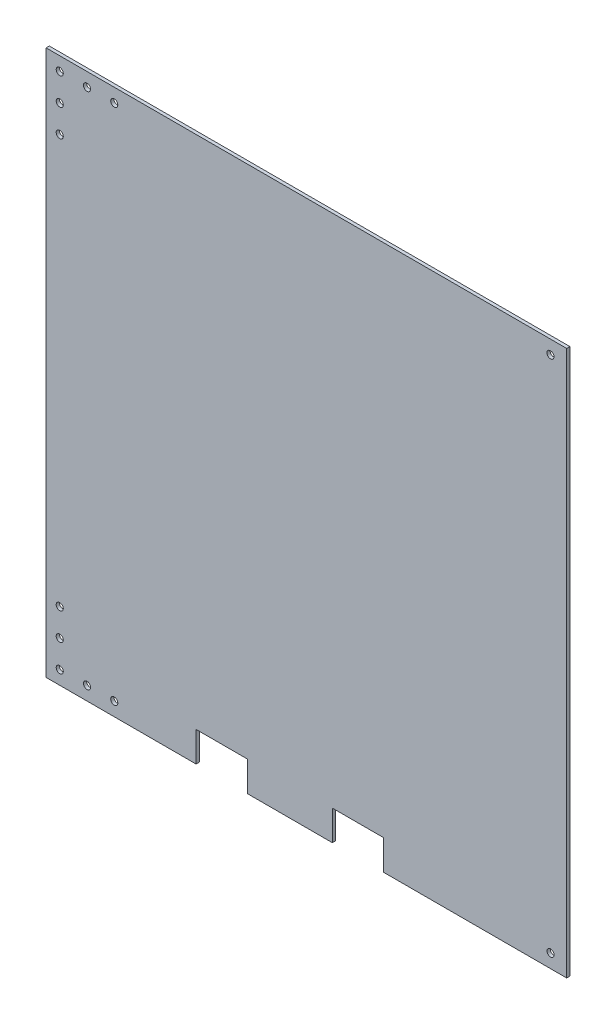
ISO-10303-21;
HEADER;
FILE_DESCRIPTION(('STEP AP214'),'2;1');
FILE_NAME('part.step','',(''),(''),'','','');
FILE_SCHEMA(('AUTOMOTIVE_DESIGN { 1 0 10303 214 1 1 1 1 }'));
ENDSEC;
DATA;
#1=APPLICATION_CONTEXT('core data for automotive mechanical design processes');
#2=APPLICATION_PROTOCOL_DEFINITION('international standard','automotive_design',2000,#1);
#3=PRODUCT_CONTEXT('',#1,'mechanical');
#4=PRODUCT('Part','Part','',(#3));
#5=PRODUCT_RELATED_PRODUCT_CATEGORY('part','',(#4));
#6=PRODUCT_DEFINITION_FORMATION('','',#4);
#7=PRODUCT_DEFINITION_CONTEXT('part definition',#1,'design');
#8=PRODUCT_DEFINITION('design','',#6,#7);
#9=PRODUCT_DEFINITION_SHAPE('','',#8);
#10=(LENGTH_UNIT() NAMED_UNIT(*) SI_UNIT(.MILLI.,.METRE.));
#11=(NAMED_UNIT(*) PLANE_ANGLE_UNIT() SI_UNIT($,.RADIAN.));
#12=(NAMED_UNIT(*) SI_UNIT($,.STERADIAN.) SOLID_ANGLE_UNIT());
#13=UNCERTAINTY_MEASURE_WITH_UNIT(LENGTH_MEASURE(1.E-05),#10,'distance_accuracy_value','');
#14=(GEOMETRIC_REPRESENTATION_CONTEXT(3) GLOBAL_UNCERTAINTY_ASSIGNED_CONTEXT((#13)) GLOBAL_UNIT_ASSIGNED_CONTEXT((#10,
#11,#12)) REPRESENTATION_CONTEXT('',''));
#15=CARTESIAN_POINT('',(0.,0.,0.));
#16=DIRECTION('',(0.,0.,1.));
#17=DIRECTION('',(1.,0.,0.));
#18=AXIS2_PLACEMENT_3D('',#15,#16,#17);
#19=CARTESIAN_POINT('',(1073.9531966176,-544.101289470653,3.));
#20=DIRECTION('',(0.,1.,0.));
#21=DIRECTION('',(0.,0.,1.));
#22=AXIS2_PLACEMENT_3D('',#19,#20,#21);
#23=PLANE('',#22);
#24=DIRECTION('',(1.,0.,0.));
#25=VECTOR('',#24,1.);
#26=CARTESIAN_POINT('',(1073.9531966176,-544.101289470653,0.));
#27=LINE('',#26,#25);
#28=CARTESIAN_POINT('',(1073.9531966176,-544.101289470653,0.));
#29=VERTEX_POINT('',#28);
#30=CARTESIAN_POINT('',(1213.6531966176,-544.101289470653,0.));
#31=VERTEX_POINT('',#30);
#32=EDGE_CURVE('E139',#29,#31,#27,.T.);
#33=ORIENTED_EDGE('',*,*,#32,.T.);
#34=DIRECTION('',(0.,0.,1.));
#35=VECTOR('',#34,1.);
#36=CARTESIAN_POINT('',(1213.6531966176,-544.101289470653,0.));
#37=LINE('',#36,#35);
#38=CARTESIAN_POINT('',(1213.6531966176,-544.101289470653,3.));
#39=VERTEX_POINT('',#38);
#40=EDGE_CURVE('E125',#31,#39,#37,.T.);
#41=ORIENTED_EDGE('',*,*,#40,.T.);
#42=DIRECTION('',(1.,0.,0.));
#43=VECTOR('',#42,1.);
#44=CARTESIAN_POINT('',(1073.9531966176,-544.101289470653,3.));
#45=LINE('',#44,#43);
#46=CARTESIAN_POINT('',(1073.9531966176,-544.101289470653,3.));
#47=VERTEX_POINT('',#46);
#48=EDGE_CURVE('E172',#47,#39,#45,.T.);
#49=ORIENTED_EDGE('',*,*,#48,.F.);
#50=DIRECTION('',(0.,0.,-1.));
#51=VECTOR('',#50,1.);
#52=CARTESIAN_POINT('',(1073.9531966176,-544.101289470653,3.));
#53=LINE('',#52,#51);
#54=EDGE_CURVE('E11',#47,#29,#53,.T.);
#55=ORIENTED_EDGE('',*,*,#54,.T.);
#56=EDGE_LOOP('',(#33,#41,#49,#55));
#57=FACE_BOUND('',#56,.T.);
#58=ADVANCED_FACE('F36',(#57),#23,.F.);
#59=CARTESIAN_POINT('',(1261.4051966176,-544.101289470653,3.));
#60=VERTEX_POINT('',#59);
#61=CARTESIAN_POINT('',(1340.6531966176,-544.101289470653,3.));
#62=VERTEX_POINT('',#61);
#63=EDGE_CURVE('E174',#60,#62,#45,.T.);
#64=ORIENTED_EDGE('',*,*,#63,.F.);
#65=DIRECTION('',(0.,0.,1.));
#66=VECTOR('',#65,1.);
#67=CARTESIAN_POINT('',(1261.4051966176,-544.101289470653,0.));
#68=LINE('',#67,#66);
#69=CARTESIAN_POINT('',(1261.4051966176,-544.101289470653,0.));
#70=VERTEX_POINT('',#69);
#71=EDGE_CURVE('E134',#70,#60,#68,.T.);
#72=ORIENTED_EDGE('',*,*,#71,.F.);
#73=CARTESIAN_POINT('',(1340.6531966176,-544.101289470653,0.));
#74=VERTEX_POINT('',#73);
#75=EDGE_CURVE('E147',#70,#74,#27,.T.);
#76=ORIENTED_EDGE('',*,*,#75,.T.);
#77=DIRECTION('',(0.,0.,1.));
#78=VECTOR('',#77,1.);
#79=CARTESIAN_POINT('',(1340.6531966176,-544.101289470653,0.));
#80=LINE('',#79,#78);
#81=EDGE_CURVE('E200',#74,#62,#80,.T.);
#82=ORIENTED_EDGE('',*,*,#81,.T.);
#83=EDGE_LOOP('',(#64,#72,#76,#82));
#84=FACE_BOUND('',#83,.T.);
#85=ADVANCED_FACE('F330',(#84),#23,.F.);
#86=CARTESIAN_POINT('',(1073.9531966176,-36.101289470653,3.));
#87=DIRECTION('',(1.,0.,0.));
#88=DIRECTION('',(0.,0.,-1.));
#89=AXIS2_PLACEMENT_3D('',#86,#87,#88);
#90=PLANE('',#89);
#91=DIRECTION('',(0.,-1.,0.));
#92=VECTOR('',#91,1.);
#93=CARTESIAN_POINT('',(1073.9531966176,-36.101289470653,0.));
#94=LINE('',#93,#92);
#95=CARTESIAN_POINT('',(1073.9531966176,-36.101289470653,0.));
#96=VERTEX_POINT('',#95);
#97=EDGE_CURVE('E154',#96,#29,#94,.T.);
#98=ORIENTED_EDGE('',*,*,#97,.T.);
#99=ORIENTED_EDGE('',*,*,#54,.F.);
#100=DIRECTION('',(0.,-1.,0.));
#101=VECTOR('',#100,1.);
#102=CARTESIAN_POINT('',(1073.9531966176,-36.101289470653,3.));
#103=LINE('',#102,#101);
#104=CARTESIAN_POINT('',(1073.9531966176,-36.101289470653,3.));
#105=VERTEX_POINT('',#104);
#106=EDGE_CURVE('E176',#105,#47,#103,.T.);
#107=ORIENTED_EDGE('',*,*,#106,.F.);
#108=DIRECTION('',(0.,0.,-1.));
#109=VECTOR('',#108,1.);
#110=CARTESIAN_POINT('',(1073.9531966176,-36.101289470653,3.));
#111=LINE('',#110,#109);
#112=EDGE_CURVE('E169',#105,#96,#111,.T.);
#113=ORIENTED_EDGE('',*,*,#112,.T.);
#114=EDGE_LOOP('',(#98,#99,#107,#113));
#115=FACE_BOUND('',#114,.T.);
#116=ADVANCED_FACE('F38',(#115),#90,.F.);
#117=CARTESIAN_POINT('',(1388.4051966176,-544.101289470653,3.));
#118=VERTEX_POINT('',#117);
#119=CARTESIAN_POINT('',(1558.9531966176,-544.101289470653,3.));
#120=VERTEX_POINT('',#119);
#121=EDGE_CURVE('E175',#118,#120,#45,.T.);
#122=ORIENTED_EDGE('',*,*,#121,.F.);
#123=DIRECTION('',(0.,0.,1.));
#124=VECTOR('',#123,1.);
#125=CARTESIAN_POINT('',(1388.4051966176,-544.101289470653,0.));
#126=LINE('',#125,#124);
#127=CARTESIAN_POINT('',(1388.4051966176,-544.101289470653,0.));
#128=VERTEX_POINT('',#127);
#129=EDGE_CURVE('E203',#128,#118,#126,.T.);
#130=ORIENTED_EDGE('',*,*,#129,.F.);
#131=CARTESIAN_POINT('',(1558.9531966176,-544.101289470653,0.));
#132=VERTEX_POINT('',#131);
#133=EDGE_CURVE('E149',#128,#132,#27,.T.);
#134=ORIENTED_EDGE('',*,*,#133,.T.);
#135=DIRECTION('',(0.,0.,-1.));
#136=VECTOR('',#135,1.);
#137=CARTESIAN_POINT('',(1558.9531966176,-544.101289470653,3.));
#138=LINE('',#137,#136);
#139=EDGE_CURVE('E44',#120,#132,#138,.T.);
#140=ORIENTED_EDGE('',*,*,#139,.F.);
#141=EDGE_LOOP('',(#122,#130,#134,#140));
#142=FACE_BOUND('',#141,.T.);
#143=ADVANCED_FACE('F331',(#142),#23,.F.);
#144=CARTESIAN_POINT('',(1558.9531966176,-36.101289470653,3.));
#145=DIRECTION('',(-1.,0.,0.));
#146=DIRECTION('',(0.,0.,1.));
#147=AXIS2_PLACEMENT_3D('',#144,#145,#146);
#148=PLANE('',#147);
#149=DIRECTION('',(0.,1.,0.));
#150=VECTOR('',#149,1.);
#151=CARTESIAN_POINT('',(1558.9531966176,-36.101289470653,0.));
#152=LINE('',#151,#150);
#153=CARTESIAN_POINT('',(1558.9531966176,-36.101289470653,0.));
#154=VERTEX_POINT('',#153);
#155=EDGE_CURVE('E146',#132,#154,#152,.T.);
#156=ORIENTED_EDGE('',*,*,#155,.T.);
#157=DIRECTION('',(0.,0.,-1.));
#158=VECTOR('',#157,1.);
#159=CARTESIAN_POINT('',(1558.9531966176,-36.101289470653,3.));
#160=LINE('',#159,#158);
#161=CARTESIAN_POINT('',(1558.9531966176,-36.101289470653,3.));
#162=VERTEX_POINT('',#161);
#163=EDGE_CURVE('E604',#162,#154,#160,.T.);
#164=ORIENTED_EDGE('',*,*,#163,.F.);
#165=DIRECTION('',(0.,1.,0.));
#166=VECTOR('',#165,1.);
#167=CARTESIAN_POINT('',(1558.9531966176,-36.101289470653,3.));
#168=LINE('',#167,#166);
#169=EDGE_CURVE('E170',#120,#162,#168,.T.);
#170=ORIENTED_EDGE('',*,*,#169,.F.);
#171=ORIENTED_EDGE('',*,*,#139,.T.);
#172=EDGE_LOOP('',(#156,#164,#170,#171));
#173=FACE_BOUND('',#172,.T.);
#174=ADVANCED_FACE('F338',(#173),#148,.F.);
#175=CARTESIAN_POINT('',(1073.9531966176,-36.101289470653,3.));
#176=DIRECTION('',(0.,-1.,0.));
#177=DIRECTION('',(0.,0.,-1.));
#178=AXIS2_PLACEMENT_3D('',#175,#176,#177);
#179=PLANE('',#178);
#180=DIRECTION('',(-1.,0.,0.));
#181=VECTOR('',#180,1.);
#182=CARTESIAN_POINT('',(1073.9531966176,-36.101289470653,0.));
#183=LINE('',#182,#181);
#184=EDGE_CURVE('E150',#154,#96,#183,.T.);
#185=ORIENTED_EDGE('',*,*,#184,.T.);
#186=ORIENTED_EDGE('',*,*,#112,.F.);
#187=DIRECTION('',(-1.,0.,0.));
#188=VECTOR('',#187,1.);
#189=CARTESIAN_POINT('',(1073.9531966176,-36.101289470653,3.));
#190=LINE('',#189,#188);
#191=EDGE_CURVE('E167',#162,#105,#190,.T.);
#192=ORIENTED_EDGE('',*,*,#191,.F.);
#193=ORIENTED_EDGE('',*,*,#163,.T.);
#194=EDGE_LOOP('',(#185,#186,#192,#193));
#195=FACE_BOUND('',#194,.T.);
#196=ADVANCED_FACE('F298',(#195),#179,.F.);
#197=CARTESIAN_POINT('',(0.,0.,3.));
#198=DIRECTION('',(0.,0.,1.));
#199=DIRECTION('',(1.,0.,0.));
#200=AXIS2_PLACEMENT_3D('',#197,#198,#199);
#201=PLANE('',#200);
#202=CARTESIAN_POINT('',(1137.4531966176,-531.401289470653,3.));
#203=DIRECTION('',(0.,0.,1.));
#204=DIRECTION('',(1.,0.,0.));
#205=AXIS2_PLACEMENT_3D('',#202,#203,#204);
#206=CIRCLE('',#205,3.30199999999981);
#207=CARTESIAN_POINT('',(1140.7551966176,-531.401289470653,3.));
#208=VERTEX_POINT('',#207);
#209=EDGE_CURVE('E243',#208,#208,#206,.T.);
#210=ORIENTED_EDGE('',*,*,#209,.F.);
#211=EDGE_LOOP('',(#210));
#212=FACE_BOUND('',#211,.T.);
#213=CARTESIAN_POINT('',(1112.0531966176,-531.401289470653,3.));
#214=DIRECTION('',(0.,0.,1.));
#215=DIRECTION('',(1.,0.,0.));
#216=AXIS2_PLACEMENT_3D('',#213,#214,#215);
#217=CIRCLE('',#216,3.30199999999981);
#218=CARTESIAN_POINT('',(1115.3551966176,-531.401289470653,3.));
#219=VERTEX_POINT('',#218);
#220=EDGE_CURVE('E249',#219,#219,#217,.T.);
#221=ORIENTED_EDGE('',*,*,#220,.F.);
#222=EDGE_LOOP('',(#221));
#223=FACE_BOUND('',#222,.T.);
#224=CARTESIAN_POINT('',(1086.6531966176,-506.001289470653,3.));
#225=DIRECTION('',(0.,0.,1.));
#226=DIRECTION('',(1.,0.,0.));
#227=AXIS2_PLACEMENT_3D('',#224,#225,#226);
#228=CIRCLE('',#227,3.30199999999981);
#229=CARTESIAN_POINT('',(1089.9551966176,-506.001289470653,3.));
#230=VERTEX_POINT('',#229);
#231=EDGE_CURVE('E255',#230,#230,#228,.T.);
#232=ORIENTED_EDGE('',*,*,#231,.F.);
#233=EDGE_LOOP('',(#232));
#234=FACE_BOUND('',#233,.T.);
#235=CARTESIAN_POINT('',(1086.6531966176,-480.601289470653,3.));
#236=DIRECTION('',(0.,0.,1.));
#237=DIRECTION('',(1.,0.,0.));
#238=AXIS2_PLACEMENT_3D('',#235,#236,#237);
#239=CIRCLE('',#238,3.30199999999982);
#240=CARTESIAN_POINT('',(1089.9551966176,-480.601289470653,3.));
#241=VERTEX_POINT('',#240);
#242=EDGE_CURVE('E261',#241,#241,#239,.T.);
#243=ORIENTED_EDGE('',*,*,#242,.F.);
#244=EDGE_LOOP('',(#243));
#245=FACE_BOUND('',#244,.T.);
#246=CARTESIAN_POINT('',(1086.6531966176,-99.601289470653,3.));
#247=DIRECTION('',(0.,0.,1.));
#248=DIRECTION('',(1.,0.,0.));
#249=AXIS2_PLACEMENT_3D('',#246,#247,#248);
#250=CIRCLE('',#249,3.30199999999982);
#251=CARTESIAN_POINT('',(1089.9551966176,-99.601289470653,3.));
#252=VERTEX_POINT('',#251);
#253=EDGE_CURVE('E267',#252,#252,#250,.T.);
#254=ORIENTED_EDGE('',*,*,#253,.F.);
#255=EDGE_LOOP('',(#254));
#256=FACE_BOUND('',#255,.T.);
#257=CARTESIAN_POINT('',(1086.6531966176,-74.201289470653,3.));
#258=DIRECTION('',(0.,0.,1.));
#259=DIRECTION('',(1.,0.,0.));
#260=AXIS2_PLACEMENT_3D('',#257,#258,#259);
#261=CIRCLE('',#260,3.30199999999982);
#262=CARTESIAN_POINT('',(1089.9551966176,-74.201289470653,3.));
#263=VERTEX_POINT('',#262);
#264=EDGE_CURVE('E273',#263,#263,#261,.T.);
#265=ORIENTED_EDGE('',*,*,#264,.F.);
#266=EDGE_LOOP('',(#265));
#267=FACE_BOUND('',#266,.T.);
#268=CARTESIAN_POINT('',(1137.4531966176,-48.801289470653,3.));
#269=DIRECTION('',(0.,0.,1.));
#270=DIRECTION('',(1.,0.,0.));
#271=AXIS2_PLACEMENT_3D('',#268,#269,#270);
#272=CIRCLE('',#271,3.30199999999982);
#273=CARTESIAN_POINT('',(1140.7551966176,-48.801289470653,3.));
#274=VERTEX_POINT('',#273);
#275=EDGE_CURVE('E279',#274,#274,#272,.T.);
#276=ORIENTED_EDGE('',*,*,#275,.F.);
#277=EDGE_LOOP('',(#276));
#278=FACE_BOUND('',#277,.T.);
#279=CARTESIAN_POINT('',(1112.0531966176,-48.801289470653,3.));
#280=DIRECTION('',(0.,0.,1.));
#281=DIRECTION('',(1.,0.,0.));
#282=AXIS2_PLACEMENT_3D('',#279,#280,#281);
#283=CIRCLE('',#282,3.30199999999982);
#284=CARTESIAN_POINT('',(1115.3551966176,-48.801289470653,3.));
#285=VERTEX_POINT('',#284);
#286=EDGE_CURVE('E237',#285,#285,#283,.T.);
#287=ORIENTED_EDGE('',*,*,#286,.F.);
#288=EDGE_LOOP('',(#287));
#289=FACE_BOUND('',#288,.T.);
#290=DIRECTION('',(0.,-1.,0.));
#291=VECTOR('',#290,1.);
#292=CARTESIAN_POINT('',(1213.6531966176,-544.101289470653,3.));
#293=LINE('',#292,#291);
#294=CARTESIAN_POINT('',(1213.6531966176,-516.161289470653,3.));
#295=VERTEX_POINT('',#294);
#296=EDGE_CURVE('E130',#295,#39,#293,.T.);
#297=ORIENTED_EDGE('',*,*,#296,.F.);
#298=DIRECTION('',(-1.,0.,0.));
#299=VECTOR('',#298,1.);
#300=CARTESIAN_POINT('',(1213.6531966176,-516.161289470653,3.));
#301=LINE('',#300,#299);
#302=CARTESIAN_POINT('',(1261.4051966176,-516.161289470653,3.));
#303=VERTEX_POINT('',#302);
#304=EDGE_CURVE('E142',#303,#295,#301,.T.);
#305=ORIENTED_EDGE('',*,*,#304,.F.);
#306=DIRECTION('',(0.,1.,0.));
#307=VECTOR('',#306,1.);
#308=CARTESIAN_POINT('',(1261.4051966176,-544.101289470653,3.));
#309=LINE('',#308,#307);
#310=EDGE_CURVE('E231',#60,#303,#309,.T.);
#311=ORIENTED_EDGE('',*,*,#310,.F.);
#312=ORIENTED_EDGE('',*,*,#63,.T.);
#313=DIRECTION('',(0.,-1.,0.));
#314=VECTOR('',#313,1.);
#315=CARTESIAN_POINT('',(1340.6531966176,-544.101289470653,3.));
#316=LINE('',#315,#314);
#317=CARTESIAN_POINT('',(1340.6531966176,-516.161289470653,3.));
#318=VERTEX_POINT('',#317);
#319=EDGE_CURVE('E216',#318,#62,#316,.T.);
#320=ORIENTED_EDGE('',*,*,#319,.F.);
#321=DIRECTION('',(-1.,0.,0.));
#322=VECTOR('',#321,1.);
#323=CARTESIAN_POINT('',(1340.6531966176,-516.161289470653,3.));
#324=LINE('',#323,#322);
#325=CARTESIAN_POINT('',(1388.4051966176,-516.161289470653,3.));
#326=VERTEX_POINT('',#325);
#327=EDGE_CURVE('E209',#326,#318,#324,.T.);
#328=ORIENTED_EDGE('',*,*,#327,.F.);
#329=DIRECTION('',(0.,1.,0.));
#330=VECTOR('',#329,1.);
#331=CARTESIAN_POINT('',(1388.4051966176,-544.101289470653,3.));
#332=LINE('',#331,#330);
#333=EDGE_CURVE('E213',#118,#326,#332,.T.);
#334=ORIENTED_EDGE('',*,*,#333,.F.);
#335=ORIENTED_EDGE('',*,*,#121,.T.);
#336=ORIENTED_EDGE('',*,*,#169,.T.);
#337=ORIENTED_EDGE('',*,*,#191,.T.);
#338=ORIENTED_EDGE('',*,*,#106,.T.);
#339=ORIENTED_EDGE('',*,*,#48,.T.);
#340=EDGE_LOOP('',(#297,#305,#311,#312,#320,#328,#334,#335,#336,#337,#338,#339));
#341=FACE_BOUND('',#340,.T.);
#342=CARTESIAN_POINT('',(1086.6531966176,-531.401289470653,3.));
#343=DIRECTION('',(0.,0.,1.));
#344=DIRECTION('',(1.,0.,0.));
#345=AXIS2_PLACEMENT_3D('',#342,#343,#344);
#346=CIRCLE('',#345,3.29500000000008);
#347=CARTESIAN_POINT('',(1089.9481966176,-531.401289470653,3.));
#348=VERTEX_POINT('',#347);
#349=EDGE_CURVE('E182',#348,#348,#346,.T.);
#350=ORIENTED_EDGE('',*,*,#349,.F.);
#351=EDGE_LOOP('',(#350));
#352=FACE_BOUND('',#351,.T.);
#353=CARTESIAN_POINT('',(1543.9671966176,-531.401289470653,3.));
#354=DIRECTION('',(0.,0.,1.));
#355=DIRECTION('',(1.,0.,0.));
#356=AXIS2_PLACEMENT_3D('',#353,#354,#355);
#357=CIRCLE('',#356,3.29500000000008);
#358=CARTESIAN_POINT('',(1547.2621966176,-531.401289470653,3.));
#359=VERTEX_POINT('',#358);
#360=EDGE_CURVE('E189',#359,#359,#357,.T.);
#361=ORIENTED_EDGE('',*,*,#360,.F.);
#362=EDGE_LOOP('',(#361));
#363=FACE_BOUND('',#362,.T.);
#364=CARTESIAN_POINT('',(1543.8531966176,-48.801289470653,3.));
#365=DIRECTION('',(0.,0.,1.));
#366=DIRECTION('',(1.,0.,0.));
#367=AXIS2_PLACEMENT_3D('',#364,#365,#366);
#368=CIRCLE('',#367,3.2950000000001);
#369=CARTESIAN_POINT('',(1547.1481966176,-48.801289470653,3.));
#370=VERTEX_POINT('',#369);
#371=EDGE_CURVE('E195',#370,#370,#368,.T.);
#372=ORIENTED_EDGE('',*,*,#371,.F.);
#373=EDGE_LOOP('',(#372));
#374=FACE_BOUND('',#373,.T.);
#375=CARTESIAN_POINT('',(1086.6531966176,-48.801289470653,3.));
#376=DIRECTION('',(0.,0.,1.));
#377=DIRECTION('',(1.,0.,0.));
#378=AXIS2_PLACEMENT_3D('',#375,#376,#377);
#379=CIRCLE('',#378,3.2950000000001);
#380=CARTESIAN_POINT('',(1089.9481966176,-48.801289470653,3.));
#381=VERTEX_POINT('',#380);
#382=EDGE_CURVE('E164',#381,#381,#379,.T.);
#383=ORIENTED_EDGE('',*,*,#382,.F.);
#384=EDGE_LOOP('',(#383));
#385=FACE_BOUND('',#384,.T.);
#386=ADVANCED_FACE('F295',(#212,#223,#234,#245,#256,#267,#278,#289,#341,#352,#363,#374,#385),
#201,.T.);
#387=CARTESIAN_POINT('',(0.,0.,0.));
#388=DIRECTION('',(0.,0.,1.));
#389=DIRECTION('',(1.,0.,0.));
#390=AXIS2_PLACEMENT_3D('',#387,#388,#389);
#391=PLANE('',#390);
#392=CARTESIAN_POINT('',(1137.4531966176,-531.401289470653,0.));
#393=DIRECTION('',(0.,0.,1.));
#394=DIRECTION('',(1.,0.,0.));
#395=AXIS2_PLACEMENT_3D('',#392,#393,#394);
#396=CIRCLE('',#395,3.30199999999981);
#397=CARTESIAN_POINT('',(1140.7551966176,-531.401289470653,0.));
#398=VERTEX_POINT('',#397);
#399=EDGE_CURVE('E246',#398,#398,#396,.T.);
#400=ORIENTED_EDGE('',*,*,#399,.T.);
#401=EDGE_LOOP('',(#400));
#402=FACE_BOUND('',#401,.T.);
#403=CARTESIAN_POINT('',(1112.0531966176,-531.401289470653,0.));
#404=DIRECTION('',(0.,0.,1.));
#405=DIRECTION('',(1.,0.,0.));
#406=AXIS2_PLACEMENT_3D('',#403,#404,#405);
#407=CIRCLE('',#406,3.30199999999981);
#408=CARTESIAN_POINT('',(1115.3551966176,-531.401289470653,0.));
#409=VERTEX_POINT('',#408);
#410=EDGE_CURVE('E252',#409,#409,#407,.T.);
#411=ORIENTED_EDGE('',*,*,#410,.T.);
#412=EDGE_LOOP('',(#411));
#413=FACE_BOUND('',#412,.T.);
#414=CARTESIAN_POINT('',(1086.6531966176,-506.001289470653,0.));
#415=DIRECTION('',(0.,0.,1.));
#416=DIRECTION('',(1.,0.,0.));
#417=AXIS2_PLACEMENT_3D('',#414,#415,#416);
#418=CIRCLE('',#417,3.30199999999981);
#419=CARTESIAN_POINT('',(1089.9551966176,-506.001289470653,0.));
#420=VERTEX_POINT('',#419);
#421=EDGE_CURVE('E258',#420,#420,#418,.T.);
#422=ORIENTED_EDGE('',*,*,#421,.T.);
#423=EDGE_LOOP('',(#422));
#424=FACE_BOUND('',#423,.T.);
#425=CARTESIAN_POINT('',(1086.6531966176,-480.601289470653,0.));
#426=DIRECTION('',(0.,0.,1.));
#427=DIRECTION('',(1.,0.,0.));
#428=AXIS2_PLACEMENT_3D('',#425,#426,#427);
#429=CIRCLE('',#428,3.30199999999982);
#430=CARTESIAN_POINT('',(1089.9551966176,-480.601289470653,0.));
#431=VERTEX_POINT('',#430);
#432=EDGE_CURVE('E264',#431,#431,#429,.T.);
#433=ORIENTED_EDGE('',*,*,#432,.T.);
#434=EDGE_LOOP('',(#433));
#435=FACE_BOUND('',#434,.T.);
#436=CARTESIAN_POINT('',(1086.6531966176,-99.601289470653,0.));
#437=DIRECTION('',(0.,0.,1.));
#438=DIRECTION('',(1.,0.,0.));
#439=AXIS2_PLACEMENT_3D('',#436,#437,#438);
#440=CIRCLE('',#439,3.30199999999982);
#441=CARTESIAN_POINT('',(1089.9551966176,-99.601289470653,0.));
#442=VERTEX_POINT('',#441);
#443=EDGE_CURVE('E270',#442,#442,#440,.T.);
#444=ORIENTED_EDGE('',*,*,#443,.T.);
#445=EDGE_LOOP('',(#444));
#446=FACE_BOUND('',#445,.T.);
#447=CARTESIAN_POINT('',(1086.6531966176,-74.201289470653,0.));
#448=DIRECTION('',(0.,0.,1.));
#449=DIRECTION('',(1.,0.,0.));
#450=AXIS2_PLACEMENT_3D('',#447,#448,#449);
#451=CIRCLE('',#450,3.30199999999982);
#452=CARTESIAN_POINT('',(1089.9551966176,-74.201289470653,0.));
#453=VERTEX_POINT('',#452);
#454=EDGE_CURVE('E276',#453,#453,#451,.T.);
#455=ORIENTED_EDGE('',*,*,#454,.T.);
#456=EDGE_LOOP('',(#455));
#457=FACE_BOUND('',#456,.T.);
#458=CARTESIAN_POINT('',(1137.4531966176,-48.801289470653,0.));
#459=DIRECTION('',(0.,0.,1.));
#460=DIRECTION('',(1.,0.,0.));
#461=AXIS2_PLACEMENT_3D('',#458,#459,#460);
#462=CIRCLE('',#461,3.30199999999982);
#463=CARTESIAN_POINT('',(1140.7551966176,-48.801289470653,0.));
#464=VERTEX_POINT('',#463);
#465=EDGE_CURVE('E240',#464,#464,#462,.T.);
#466=ORIENTED_EDGE('',*,*,#465,.T.);
#467=EDGE_LOOP('',(#466));
#468=FACE_BOUND('',#467,.T.);
#469=CARTESIAN_POINT('',(1112.0531966176,-48.801289470653,0.));
#470=DIRECTION('',(0.,0.,1.));
#471=DIRECTION('',(1.,0.,0.));
#472=AXIS2_PLACEMENT_3D('',#469,#470,#471);
#473=CIRCLE('',#472,3.30199999999982);
#474=CARTESIAN_POINT('',(1115.3551966176,-48.801289470653,0.));
#475=VERTEX_POINT('',#474);
#476=EDGE_CURVE('E218',#475,#475,#473,.T.);
#477=ORIENTED_EDGE('',*,*,#476,.T.);
#478=EDGE_LOOP('',(#477));
#479=FACE_BOUND('',#478,.T.);
#480=CARTESIAN_POINT('',(1086.6531966176,-531.401289470653,0.));
#481=DIRECTION('',(0.,0.,1.));
#482=DIRECTION('',(1.,0.,0.));
#483=AXIS2_PLACEMENT_3D('',#480,#481,#482);
#484=CIRCLE('',#483,3.29500000000008);
#485=CARTESIAN_POINT('',(1089.9481966176,-531.401289470653,0.));
#486=VERTEX_POINT('',#485);
#487=EDGE_CURVE('E185',#486,#486,#484,.T.);
#488=ORIENTED_EDGE('',*,*,#487,.T.);
#489=EDGE_LOOP('',(#488));
#490=FACE_BOUND('',#489,.T.);
#491=CARTESIAN_POINT('',(1543.9671966176,-531.401289470653,0.));
#492=DIRECTION('',(0.,0.,1.));
#493=DIRECTION('',(1.,0.,0.));
#494=AXIS2_PLACEMENT_3D('',#491,#492,#493);
#495=CIRCLE('',#494,3.29500000000008);
#496=CARTESIAN_POINT('',(1547.2621966176,-531.401289470653,0.));
#497=VERTEX_POINT('',#496);
#498=EDGE_CURVE('E192',#497,#497,#495,.T.);
#499=ORIENTED_EDGE('',*,*,#498,.T.);
#500=EDGE_LOOP('',(#499));
#501=FACE_BOUND('',#500,.T.);
#502=CARTESIAN_POINT('',(1543.8531966176,-48.801289470653,0.));
#503=DIRECTION('',(0.,0.,1.));
#504=DIRECTION('',(1.,0.,0.));
#505=AXIS2_PLACEMENT_3D('',#502,#503,#504);
#506=CIRCLE('',#505,3.2950000000001);
#507=CARTESIAN_POINT('',(1547.1481966176,-48.801289470653,0.));
#508=VERTEX_POINT('',#507);
#509=EDGE_CURVE('E180',#508,#508,#506,.T.);
#510=ORIENTED_EDGE('',*,*,#509,.T.);
#511=EDGE_LOOP('',(#510));
#512=FACE_BOUND('',#511,.T.);
#513=CARTESIAN_POINT('',(1086.6531966176,-48.801289470653,0.));
#514=DIRECTION('',(0.,0.,1.));
#515=DIRECTION('',(1.,0.,0.));
#516=AXIS2_PLACEMENT_3D('',#513,#514,#515);
#517=CIRCLE('',#516,3.2950000000001);
#518=CARTESIAN_POINT('',(1089.9481966176,-48.801289470653,0.));
#519=VERTEX_POINT('',#518);
#520=EDGE_CURVE('E160',#519,#519,#517,.T.);
#521=ORIENTED_EDGE('',*,*,#520,.T.);
#522=EDGE_LOOP('',(#521));
#523=FACE_BOUND('',#522,.T.);
#524=DIRECTION('',(-1.,0.,0.));
#525=VECTOR('',#524,1.);
#526=CARTESIAN_POINT('',(1213.6531966176,-516.161289470653,0.));
#527=LINE('',#526,#525);
#528=CARTESIAN_POINT('',(1261.4051966176,-516.161289470653,0.));
#529=VERTEX_POINT('',#528);
#530=CARTESIAN_POINT('',(1213.6531966176,-516.161289470653,0.));
#531=VERTEX_POINT('',#530);
#532=EDGE_CURVE('E51',#529,#531,#527,.T.);
#533=ORIENTED_EDGE('',*,*,#532,.T.);
#534=DIRECTION('',(0.,-1.,0.));
#535=VECTOR('',#534,1.);
#536=CARTESIAN_POINT('',(1213.6531966176,-544.101289470653,0.));
#537=LINE('',#536,#535);
#538=EDGE_CURVE('E128',#531,#31,#537,.T.);
#539=ORIENTED_EDGE('',*,*,#538,.T.);
#540=ORIENTED_EDGE('',*,*,#32,.F.);
#541=ORIENTED_EDGE('',*,*,#97,.F.);
#542=ORIENTED_EDGE('',*,*,#184,.F.);
#543=ORIENTED_EDGE('',*,*,#155,.F.);
#544=ORIENTED_EDGE('',*,*,#133,.F.);
#545=DIRECTION('',(0.,1.,0.));
#546=VECTOR('',#545,1.);
#547=CARTESIAN_POINT('',(1388.4051966176,-544.101289470653,0.));
#548=LINE('',#547,#546);
#549=CARTESIAN_POINT('',(1388.4051966176,-516.161289470653,0.));
#550=VERTEX_POINT('',#549);
#551=EDGE_CURVE('E220',#128,#550,#548,.T.);
#552=ORIENTED_EDGE('',*,*,#551,.T.);
#553=DIRECTION('',(-1.,0.,0.));
#554=VECTOR('',#553,1.);
#555=CARTESIAN_POINT('',(1340.6531966176,-516.161289470653,0.));
#556=LINE('',#555,#554);
#557=CARTESIAN_POINT('',(1340.6531966176,-516.161289470653,0.));
#558=VERTEX_POINT('',#557);
#559=EDGE_CURVE('E59',#550,#558,#556,.T.);
#560=ORIENTED_EDGE('',*,*,#559,.T.);
#561=DIRECTION('',(0.,-1.,0.));
#562=VECTOR('',#561,1.);
#563=CARTESIAN_POINT('',(1340.6531966176,-544.101289470653,0.));
#564=LINE('',#563,#562);
#565=EDGE_CURVE('E212',#558,#74,#564,.T.);
#566=ORIENTED_EDGE('',*,*,#565,.T.);
#567=ORIENTED_EDGE('',*,*,#75,.F.);
#568=DIRECTION('',(0.,1.,0.));
#569=VECTOR('',#568,1.);
#570=CARTESIAN_POINT('',(1261.4051966176,-544.101289470653,0.));
#571=LINE('',#570,#569);
#572=EDGE_CURVE('E141',#70,#529,#571,.T.);
#573=ORIENTED_EDGE('',*,*,#572,.T.);
#574=EDGE_LOOP('',(#533,#539,#540,#541,#542,#543,#544,#552,#560,#566,#567,#573));
#575=FACE_BOUND('',#574,.T.);
#576=ADVANCED_FACE('F137',(#402,#413,#424,#435,#446,#457,#468,#479,#490,#501,#512,#523,#575),
#391,.F.);
#577=CARTESIAN_POINT('',(1086.6531966176,-48.801289470653,0.));
#578=DIRECTION('',(0.,0.,1.));
#579=DIRECTION('',(1.,0.,0.));
#580=AXIS2_PLACEMENT_3D('',#577,#578,#579);
#581=CYLINDRICAL_SURFACE('',#580,3.2950000000001);
#582=ORIENTED_EDGE('',*,*,#520,.F.);
#583=EDGE_LOOP('',(#582));
#584=FACE_BOUND('',#583,.T.);
#585=ORIENTED_EDGE('',*,*,#382,.T.);
#586=EDGE_LOOP('',(#585));
#587=FACE_BOUND('',#586,.T.);
#588=ADVANCED_FACE('F313',(#584,#587),#581,.F.);
#589=CARTESIAN_POINT('',(1543.8531966176,-48.801289470653,0.));
#590=DIRECTION('',(0.,0.,1.));
#591=DIRECTION('',(1.,0.,0.));
#592=AXIS2_PLACEMENT_3D('',#589,#590,#591);
#593=CYLINDRICAL_SURFACE('',#592,3.2950000000001);
#594=ORIENTED_EDGE('',*,*,#509,.F.);
#595=EDGE_LOOP('',(#594));
#596=FACE_BOUND('',#595,.T.);
#597=ORIENTED_EDGE('',*,*,#371,.T.);
#598=EDGE_LOOP('',(#597));
#599=FACE_BOUND('',#598,.T.);
#600=ADVANCED_FACE('F315',(#596,#599),#593,.F.);
#601=CARTESIAN_POINT('',(1543.9671966176,-531.401289470653,0.));
#602=DIRECTION('',(0.,0.,1.));
#603=DIRECTION('',(1.,0.,0.));
#604=AXIS2_PLACEMENT_3D('',#601,#602,#603);
#605=CYLINDRICAL_SURFACE('',#604,3.29500000000008);
#606=ORIENTED_EDGE('',*,*,#498,.F.);
#607=EDGE_LOOP('',(#606));
#608=FACE_BOUND('',#607,.T.);
#609=ORIENTED_EDGE('',*,*,#360,.T.);
#610=EDGE_LOOP('',(#609));
#611=FACE_BOUND('',#610,.T.);
#612=ADVANCED_FACE('F322',(#608,#611),#605,.F.);
#613=CARTESIAN_POINT('',(1086.6531966176,-531.401289470653,0.));
#614=DIRECTION('',(0.,0.,1.));
#615=DIRECTION('',(1.,0.,0.));
#616=AXIS2_PLACEMENT_3D('',#613,#614,#615);
#617=CYLINDRICAL_SURFACE('',#616,3.29500000000008);
#618=ORIENTED_EDGE('',*,*,#487,.F.);
#619=EDGE_LOOP('',(#618));
#620=FACE_BOUND('',#619,.T.);
#621=ORIENTED_EDGE('',*,*,#349,.T.);
#622=EDGE_LOOP('',(#621));
#623=FACE_BOUND('',#622,.T.);
#624=ADVANCED_FACE('F368',(#620,#623),#617,.F.);
#625=CARTESIAN_POINT('',(1340.6531966176,-544.101289470653,0.));
#626=DIRECTION('',(-1.,0.,0.));
#627=DIRECTION('',(0.,0.,1.));
#628=AXIS2_PLACEMENT_3D('',#625,#626,#627);
#629=PLANE('',#628);
#630=ORIENTED_EDGE('',*,*,#319,.T.);
#631=ORIENTED_EDGE('',*,*,#81,.F.);
#632=ORIENTED_EDGE('',*,*,#565,.F.);
#633=DIRECTION('',(0.,0.,1.));
#634=VECTOR('',#633,1.);
#635=CARTESIAN_POINT('',(1340.6531966176,-516.161289470653,0.));
#636=LINE('',#635,#634);
#637=EDGE_CURVE('E207',#558,#318,#636,.T.);
#638=ORIENTED_EDGE('',*,*,#637,.T.);
#639=EDGE_LOOP('',(#630,#631,#632,#638));
#640=FACE_BOUND('',#639,.T.);
#641=ADVANCED_FACE('F356',(#640),#629,.F.);
#642=CARTESIAN_POINT('',(1340.6531966176,-516.161289470653,0.));
#643=DIRECTION('',(0.,1.,0.));
#644=DIRECTION('',(0.,0.,1.));
#645=AXIS2_PLACEMENT_3D('',#642,#643,#644);
#646=PLANE('',#645);
#647=ORIENTED_EDGE('',*,*,#327,.T.);
#648=ORIENTED_EDGE('',*,*,#637,.F.);
#649=ORIENTED_EDGE('',*,*,#559,.F.);
#650=DIRECTION('',(0.,0.,1.));
#651=VECTOR('',#650,1.);
#652=CARTESIAN_POINT('',(1388.4051966176,-516.161289470653,0.));
#653=LINE('',#652,#651);
#654=EDGE_CURVE('E205',#550,#326,#653,.T.);
#655=ORIENTED_EDGE('',*,*,#654,.T.);
#656=EDGE_LOOP('',(#647,#648,#649,#655));
#657=FACE_BOUND('',#656,.T.);
#658=ADVANCED_FACE('F360',(#657),#646,.F.);
#659=CARTESIAN_POINT('',(1388.4051966176,-544.101289470653,0.));
#660=DIRECTION('',(1.,0.,0.));
#661=DIRECTION('',(0.,0.,-1.));
#662=AXIS2_PLACEMENT_3D('',#659,#660,#661);
#663=PLANE('',#662);
#664=ORIENTED_EDGE('',*,*,#333,.T.);
#665=ORIENTED_EDGE('',*,*,#654,.F.);
#666=ORIENTED_EDGE('',*,*,#551,.F.);
#667=ORIENTED_EDGE('',*,*,#129,.T.);
#668=EDGE_LOOP('',(#664,#665,#666,#667));
#669=FACE_BOUND('',#668,.T.);
#670=ADVANCED_FACE('F359',(#669),#663,.F.);
#671=CARTESIAN_POINT('',(1213.6531966176,-544.101289470653,0.));
#672=DIRECTION('',(-1.,0.,0.));
#673=DIRECTION('',(0.,0.,1.));
#674=AXIS2_PLACEMENT_3D('',#671,#672,#673);
#675=PLANE('',#674);
#676=ORIENTED_EDGE('',*,*,#296,.T.);
#677=ORIENTED_EDGE('',*,*,#40,.F.);
#678=ORIENTED_EDGE('',*,*,#538,.F.);
#679=DIRECTION('',(0.,0.,1.));
#680=VECTOR('',#679,1.);
#681=CARTESIAN_POINT('',(1213.6531966176,-516.161289470653,0.));
#682=LINE('',#681,#680);
#683=EDGE_CURVE('E186',#531,#295,#682,.T.);
#684=ORIENTED_EDGE('',*,*,#683,.T.);
#685=EDGE_LOOP('',(#676,#677,#678,#684));
#686=FACE_BOUND('',#685,.T.);
#687=ADVANCED_FACE('F127',(#686),#675,.F.);
#688=CARTESIAN_POINT('',(1213.6531966176,-516.161289470653,0.));
#689=DIRECTION('',(0.,1.,0.));
#690=DIRECTION('',(0.,0.,1.));
#691=AXIS2_PLACEMENT_3D('',#688,#689,#690);
#692=PLANE('',#691);
#693=ORIENTED_EDGE('',*,*,#304,.T.);
#694=ORIENTED_EDGE('',*,*,#683,.F.);
#695=ORIENTED_EDGE('',*,*,#532,.F.);
#696=DIRECTION('',(0.,0.,1.));
#697=VECTOR('',#696,1.);
#698=CARTESIAN_POINT('',(1261.4051966176,-516.161289470653,0.));
#699=LINE('',#698,#697);
#700=EDGE_CURVE('E226',#529,#303,#699,.T.);
#701=ORIENTED_EDGE('',*,*,#700,.T.);
#702=EDGE_LOOP('',(#693,#694,#695,#701));
#703=FACE_BOUND('',#702,.T.);
#704=ADVANCED_FACE('F418',(#703),#692,.F.);
#705=CARTESIAN_POINT('',(1261.4051966176,-544.101289470653,0.));
#706=DIRECTION('',(1.,0.,0.));
#707=DIRECTION('',(0.,0.,-1.));
#708=AXIS2_PLACEMENT_3D('',#705,#706,#707);
#709=PLANE('',#708);
#710=ORIENTED_EDGE('',*,*,#310,.T.);
#711=ORIENTED_EDGE('',*,*,#700,.F.);
#712=ORIENTED_EDGE('',*,*,#572,.F.);
#713=ORIENTED_EDGE('',*,*,#71,.T.);
#714=EDGE_LOOP('',(#710,#711,#712,#713));
#715=FACE_BOUND('',#714,.T.);
#716=ADVANCED_FACE('F426',(#715),#709,.F.);
#717=CARTESIAN_POINT('',(1112.0531966176,-48.801289470653,0.));
#718=DIRECTION('',(0.,0.,1.));
#719=DIRECTION('',(1.,0.,0.));
#720=AXIS2_PLACEMENT_3D('',#717,#718,#719);
#721=CYLINDRICAL_SURFACE('',#720,3.30199999999982);
#722=ORIENTED_EDGE('',*,*,#476,.F.);
#723=EDGE_LOOP('',(#722));
#724=FACE_BOUND('',#723,.T.);
#725=ORIENTED_EDGE('',*,*,#286,.T.);
#726=EDGE_LOOP('',(#725));
#727=FACE_BOUND('',#726,.T.);
#728=ADVANCED_FACE('F291',(#724,#727),#721,.F.);
#729=CARTESIAN_POINT('',(1137.4531966176,-48.801289470653,0.));
#730=DIRECTION('',(0.,0.,1.));
#731=DIRECTION('',(1.,0.,0.));
#732=AXIS2_PLACEMENT_3D('',#729,#730,#731);
#733=CYLINDRICAL_SURFACE('',#732,3.30199999999982);
#734=ORIENTED_EDGE('',*,*,#465,.F.);
#735=EDGE_LOOP('',(#734));
#736=FACE_BOUND('',#735,.T.);
#737=ORIENTED_EDGE('',*,*,#275,.T.);
#738=EDGE_LOOP('',(#737));
#739=FACE_BOUND('',#738,.T.);
#740=ADVANCED_FACE('F287',(#736,#739),#733,.F.);
#741=CARTESIAN_POINT('',(1086.6531966176,-74.201289470653,0.));
#742=DIRECTION('',(0.,0.,1.));
#743=DIRECTION('',(1.,0.,0.));
#744=AXIS2_PLACEMENT_3D('',#741,#742,#743);
#745=CYLINDRICAL_SURFACE('',#744,3.30199999999982);
#746=ORIENTED_EDGE('',*,*,#454,.F.);
#747=EDGE_LOOP('',(#746));
#748=FACE_BOUND('',#747,.T.);
#749=ORIENTED_EDGE('',*,*,#264,.T.);
#750=EDGE_LOOP('',(#749));
#751=FACE_BOUND('',#750,.T.);
#752=ADVANCED_FACE('F290',(#748,#751),#745,.F.);
#753=CARTESIAN_POINT('',(1086.6531966176,-99.601289470653,0.));
#754=DIRECTION('',(0.,0.,1.));
#755=DIRECTION('',(1.,0.,0.));
#756=AXIS2_PLACEMENT_3D('',#753,#754,#755);
#757=CYLINDRICAL_SURFACE('',#756,3.30199999999982);
#758=ORIENTED_EDGE('',*,*,#443,.F.);
#759=EDGE_LOOP('',(#758));
#760=FACE_BOUND('',#759,.T.);
#761=ORIENTED_EDGE('',*,*,#253,.T.);
#762=EDGE_LOOP('',(#761));
#763=FACE_BOUND('',#762,.T.);
#764=ADVANCED_FACE('F473',(#760,#763),#757,.F.);
#765=CARTESIAN_POINT('',(1086.6531966176,-480.601289470653,0.));
#766=DIRECTION('',(0.,0.,1.));
#767=DIRECTION('',(1.,0.,0.));
#768=AXIS2_PLACEMENT_3D('',#765,#766,#767);
#769=CYLINDRICAL_SURFACE('',#768,3.30199999999982);
#770=ORIENTED_EDGE('',*,*,#432,.F.);
#771=EDGE_LOOP('',(#770));
#772=FACE_BOUND('',#771,.T.);
#773=ORIENTED_EDGE('',*,*,#242,.T.);
#774=EDGE_LOOP('',(#773));
#775=FACE_BOUND('',#774,.T.);
#776=ADVANCED_FACE('F483',(#772,#775),#769,.F.);
#777=CARTESIAN_POINT('',(1086.6531966176,-506.001289470653,0.));
#778=DIRECTION('',(0.,0.,1.));
#779=DIRECTION('',(1.,0.,0.));
#780=AXIS2_PLACEMENT_3D('',#777,#778,#779);
#781=CYLINDRICAL_SURFACE('',#780,3.30199999999981);
#782=ORIENTED_EDGE('',*,*,#421,.F.);
#783=EDGE_LOOP('',(#782));
#784=FACE_BOUND('',#783,.T.);
#785=ORIENTED_EDGE('',*,*,#231,.T.);
#786=EDGE_LOOP('',(#785));
#787=FACE_BOUND('',#786,.T.);
#788=ADVANCED_FACE('F493',(#784,#787),#781,.F.);
#789=CARTESIAN_POINT('',(1112.0531966176,-531.401289470653,0.));
#790=DIRECTION('',(0.,0.,1.));
#791=DIRECTION('',(1.,0.,0.));
#792=AXIS2_PLACEMENT_3D('',#789,#790,#791);
#793=CYLINDRICAL_SURFACE('',#792,3.30199999999981);
#794=ORIENTED_EDGE('',*,*,#410,.F.);
#795=EDGE_LOOP('',(#794));
#796=FACE_BOUND('',#795,.T.);
#797=ORIENTED_EDGE('',*,*,#220,.T.);
#798=EDGE_LOOP('',(#797));
#799=FACE_BOUND('',#798,.T.);
#800=ADVANCED_FACE('F503',(#796,#799),#793,.F.);
#801=CARTESIAN_POINT('',(1137.4531966176,-531.401289470653,0.));
#802=DIRECTION('',(0.,0.,1.));
#803=DIRECTION('',(1.,0.,0.));
#804=AXIS2_PLACEMENT_3D('',#801,#802,#803);
#805=CYLINDRICAL_SURFACE('',#804,3.30199999999981);
#806=ORIENTED_EDGE('',*,*,#399,.F.);
#807=EDGE_LOOP('',(#806));
#808=FACE_BOUND('',#807,.T.);
#809=ORIENTED_EDGE('',*,*,#209,.T.);
#810=EDGE_LOOP('',(#809));
#811=FACE_BOUND('',#810,.T.);
#812=ADVANCED_FACE('F513',(#808,#811),#805,.F.);
#813=CLOSED_SHELL('',(#58,#85,#116,#143,#174,#196,#386,#576,#588,#600,#612,#624,#641,#658,#670,
#687,#704,#716,#728,#740,#752,#764,#776,#788,#800,#812));
#814=MANIFOLD_SOLID_BREP('B2',#813);
#815=ADVANCED_BREP_SHAPE_REPRESENTATION('',(#18,#814),#14);
#816=SHAPE_DEFINITION_REPRESENTATION(#9,#815);
ENDSEC;
END-ISO-10303-21;
